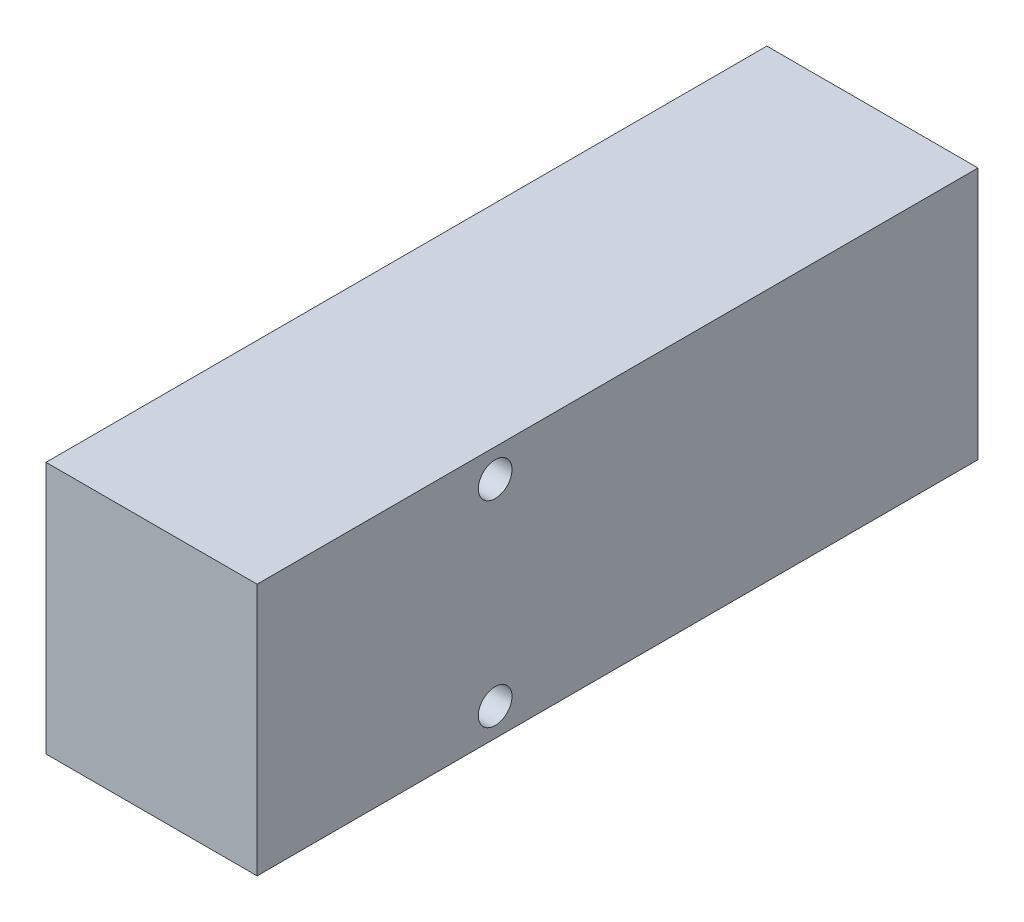
ISO-10303-21;
HEADER;
FILE_DESCRIPTION(('STEP AP214'),'2;1');
FILE_NAME('part.step','',(''),(''),'','','');
FILE_SCHEMA(('AUTOMOTIVE_DESIGN { 1 0 10303 214 1 1 1 1 }'));
ENDSEC;
DATA;
#1=APPLICATION_CONTEXT('core data for automotive mechanical design processes');
#2=APPLICATION_PROTOCOL_DEFINITION('international standard','automotive_design',2000,#1);
#3=PRODUCT_CONTEXT('',#1,'mechanical');
#4=PRODUCT('Part','Part','',(#3));
#5=PRODUCT_RELATED_PRODUCT_CATEGORY('part','',(#4));
#6=PRODUCT_DEFINITION_FORMATION('','',#4);
#7=PRODUCT_DEFINITION_CONTEXT('part definition',#1,'design');
#8=PRODUCT_DEFINITION('design','',#6,#7);
#9=PRODUCT_DEFINITION_SHAPE('','',#8);
#10=(LENGTH_UNIT() NAMED_UNIT(*) SI_UNIT(.MILLI.,.METRE.));
#11=(NAMED_UNIT(*) PLANE_ANGLE_UNIT() SI_UNIT($,.RADIAN.));
#12=(NAMED_UNIT(*) SI_UNIT($,.STERADIAN.) SOLID_ANGLE_UNIT());
#13=UNCERTAINTY_MEASURE_WITH_UNIT(LENGTH_MEASURE(1.E-05),#10,'distance_accuracy_value','');
#14=(GEOMETRIC_REPRESENTATION_CONTEXT(3) GLOBAL_UNCERTAINTY_ASSIGNED_CONTEXT((#13)) GLOBAL_UNIT_ASSIGNED_CONTEXT((#10,
#11,#12)) REPRESENTATION_CONTEXT('',''));
#15=CARTESIAN_POINT('',(0.,0.,0.));
#16=DIRECTION('',(0.,0.,1.));
#17=DIRECTION('',(1.,0.,0.));
#18=AXIS2_PLACEMENT_3D('',#15,#16,#17);
#19=CARTESIAN_POINT('',(40.,-11.25,-11.2));
#20=DIRECTION('',(0.,0.,-1.));
#21=DIRECTION('',(-1.,0.,0.));
#22=AXIS2_PLACEMENT_3D('',#19,#20,#21);
#23=PLANE('',#22);
#24=DIRECTION('',(-1.,0.,0.));
#25=VECTOR('',#24,1.);
#26=CARTESIAN_POINT('',(40.,11.25,-11.2));
#27=LINE('',#26,#25);
#28=CARTESIAN_POINT('',(40.,11.25,-11.2));
#29=VERTEX_POINT('',#28);
#30=CARTESIAN_POINT('',(21.2,11.25,-11.2));
#31=VERTEX_POINT('',#30);
#32=EDGE_CURVE('E98',#29,#31,#27,.T.);
#33=ORIENTED_EDGE('',*,*,#32,.F.);
#34=DIRECTION('',(0.,1.,0.));
#35=VECTOR('',#34,1.);
#36=CARTESIAN_POINT('',(40.,-11.25,-11.2));
#37=LINE('',#36,#35);
#38=CARTESIAN_POINT('',(40.,-11.25,-11.2));
#39=VERTEX_POINT('',#38);
#40=EDGE_CURVE('E11',#39,#29,#37,.T.);
#41=ORIENTED_EDGE('',*,*,#40,.F.);
#42=DIRECTION('',(-1.,0.,0.));
#43=VECTOR('',#42,1.);
#44=CARTESIAN_POINT('',(40.,-11.25,-11.2));
#45=LINE('',#44,#43);
#46=CARTESIAN_POINT('',(21.2,-11.25,-11.2));
#47=VERTEX_POINT('',#46);
#48=EDGE_CURVE('E92',#39,#47,#45,.T.);
#49=ORIENTED_EDGE('',*,*,#48,.T.);
#50=DIRECTION('',(0.,1.,0.));
#51=VECTOR('',#50,1.);
#52=CARTESIAN_POINT('',(21.2,-11.25,-11.2));
#53=LINE('',#52,#51);
#54=EDGE_CURVE('E35',#47,#31,#53,.T.);
#55=ORIENTED_EDGE('',*,*,#54,.T.);
#56=EDGE_LOOP('',(#33,#41,#49,#55));
#57=FACE_BOUND('',#56,.T.);
#58=ADVANCED_FACE('F32',(#57),#23,.T.);
#59=CARTESIAN_POINT('',(40.,-11.25,-11.2));
#60=DIRECTION('',(-1.,0.,0.));
#61=DIRECTION('',(0.,0.,1.));
#62=AXIS2_PLACEMENT_3D('',#59,#60,#61);
#63=PLANE('',#62);
#64=CARTESIAN_POINT('',(40.,-8.75,31.8));
#65=DIRECTION('',(-1.,0.,0.));
#66=DIRECTION('',(0.,0.,1.));
#67=AXIS2_PLACEMENT_3D('',#64,#65,#66);
#68=CIRCLE('',#67,1.5);
#69=CARTESIAN_POINT('',(40.,-8.75,33.3));
#70=VERTEX_POINT('',#69);
#71=EDGE_CURVE('E138',#70,#70,#68,.T.);
#72=ORIENTED_EDGE('',*,*,#71,.T.);
#73=EDGE_LOOP('',(#72));
#74=FACE_BOUND('',#73,.T.);
#75=CARTESIAN_POINT('',(40.,8.75,31.8));
#76=DIRECTION('',(1.,0.,0.));
#77=DIRECTION('',(0.,0.,-1.));
#78=AXIS2_PLACEMENT_3D('',#75,#76,#77);
#79=CIRCLE('',#78,1.5);
#80=CARTESIAN_POINT('',(40.,8.75,30.3));
#81=VERTEX_POINT('',#80);
#82=EDGE_CURVE('E135',#81,#81,#79,.T.);
#83=ORIENTED_EDGE('',*,*,#82,.F.);
#84=EDGE_LOOP('',(#83));
#85=FACE_BOUND('',#84,.T.);
#86=DIRECTION('',(0.,0.,1.));
#87=VECTOR('',#86,1.);
#88=CARTESIAN_POINT('',(40.,11.25,-11.2));
#89=LINE('',#88,#87);
#90=CARTESIAN_POINT('',(40.,11.25,53.));
#91=VERTEX_POINT('',#90);
#92=EDGE_CURVE('E65',#29,#91,#89,.T.);
#93=ORIENTED_EDGE('',*,*,#92,.T.);
#94=DIRECTION('',(0.,1.,0.));
#95=VECTOR('',#94,1.);
#96=CARTESIAN_POINT('',(40.,-11.25,53.));
#97=LINE('',#96,#95);
#98=CARTESIAN_POINT('',(40.,-11.25,53.));
#99=VERTEX_POINT('',#98);
#100=EDGE_CURVE('E41',#99,#91,#97,.T.);
#101=ORIENTED_EDGE('',*,*,#100,.F.);
#102=DIRECTION('',(0.,0.,1.));
#103=VECTOR('',#102,1.);
#104=CARTESIAN_POINT('',(40.,-11.25,-11.2));
#105=LINE('',#104,#103);
#106=EDGE_CURVE('E82',#39,#99,#105,.T.);
#107=ORIENTED_EDGE('',*,*,#106,.F.);
#108=ORIENTED_EDGE('',*,*,#40,.T.);
#109=EDGE_LOOP('',(#93,#101,#107,#108));
#110=FACE_BOUND('',#109,.T.);
#111=ADVANCED_FACE('F109',(#74,#85,#110),#63,.F.);
#112=CARTESIAN_POINT('',(40.,-11.25,53.));
#113=DIRECTION('',(0.,0.,-1.));
#114=DIRECTION('',(-1.,0.,0.));
#115=AXIS2_PLACEMENT_3D('',#112,#113,#114);
#116=PLANE('',#115);
#117=DIRECTION('',(-1.,0.,0.));
#118=VECTOR('',#117,1.);
#119=CARTESIAN_POINT('',(40.,11.25,53.));
#120=LINE('',#119,#118);
#121=CARTESIAN_POINT('',(21.2,11.25,53.));
#122=VERTEX_POINT('',#121);
#123=EDGE_CURVE('E89',#91,#122,#120,.T.);
#124=ORIENTED_EDGE('',*,*,#123,.T.);
#125=DIRECTION('',(0.,1.,0.));
#126=VECTOR('',#125,1.);
#127=CARTESIAN_POINT('',(21.2,-11.25,53.));
#128=LINE('',#127,#126);
#129=CARTESIAN_POINT('',(21.2,-11.25,53.));
#130=VERTEX_POINT('',#129);
#131=EDGE_CURVE('E86',#130,#122,#128,.T.);
#132=ORIENTED_EDGE('',*,*,#131,.F.);
#133=DIRECTION('',(-1.,0.,0.));
#134=VECTOR('',#133,1.);
#135=CARTESIAN_POINT('',(40.,-11.25,53.));
#136=LINE('',#135,#134);
#137=EDGE_CURVE('E77',#99,#130,#136,.T.);
#138=ORIENTED_EDGE('',*,*,#137,.F.);
#139=ORIENTED_EDGE('',*,*,#100,.T.);
#140=EDGE_LOOP('',(#124,#132,#138,#139));
#141=FACE_BOUND('',#140,.T.);
#142=ADVANCED_FACE('F87',(#141),#116,.F.);
#143=CARTESIAN_POINT('',(21.2,-11.25,-11.2));
#144=DIRECTION('',(-1.,0.,0.));
#145=DIRECTION('',(0.,0.,1.));
#146=AXIS2_PLACEMENT_3D('',#143,#144,#145);
#147=PLANE('',#146);
#148=CARTESIAN_POINT('',(21.2,-8.75,31.8));
#149=DIRECTION('',(-1.,0.,0.));
#150=DIRECTION('',(0.,0.,1.));
#151=AXIS2_PLACEMENT_3D('',#148,#149,#150);
#152=CIRCLE('',#151,1.5);
#153=CARTESIAN_POINT('',(21.2,-8.75,33.3));
#154=VERTEX_POINT('',#153);
#155=EDGE_CURVE('E131',#154,#154,#152,.T.);
#156=ORIENTED_EDGE('',*,*,#155,.F.);
#157=EDGE_LOOP('',(#156));
#158=FACE_BOUND('',#157,.T.);
#159=CARTESIAN_POINT('',(21.2,8.75,31.8));
#160=DIRECTION('',(1.,0.,0.));
#161=DIRECTION('',(0.,0.,-1.));
#162=AXIS2_PLACEMENT_3D('',#159,#160,#161);
#163=CIRCLE('',#162,1.5);
#164=CARTESIAN_POINT('',(21.2,8.75,30.3));
#165=VERTEX_POINT('',#164);
#166=EDGE_CURVE('E102',#165,#165,#163,.T.);
#167=ORIENTED_EDGE('',*,*,#166,.T.);
#168=EDGE_LOOP('',(#167));
#169=FACE_BOUND('',#168,.T.);
#170=DIRECTION('',(0.,0.,1.));
#171=VECTOR('',#170,1.);
#172=CARTESIAN_POINT('',(21.2,11.25,-11.2));
#173=LINE('',#172,#171);
#174=EDGE_CURVE('E101',#31,#122,#173,.T.);
#175=ORIENTED_EDGE('',*,*,#174,.F.);
#176=ORIENTED_EDGE('',*,*,#54,.F.);
#177=DIRECTION('',(0.,0.,1.));
#178=VECTOR('',#177,1.);
#179=CARTESIAN_POINT('',(21.2,-11.25,-11.2));
#180=LINE('',#179,#178);
#181=EDGE_CURVE('E81',#47,#130,#180,.T.);
#182=ORIENTED_EDGE('',*,*,#181,.T.);
#183=ORIENTED_EDGE('',*,*,#131,.T.);
#184=EDGE_LOOP('',(#175,#176,#182,#183));
#185=FACE_BOUND('',#184,.T.);
#186=ADVANCED_FACE('F91',(#158,#169,#185),#147,.T.);
#187=CARTESIAN_POINT('',(0.,-11.25,0.));
#188=DIRECTION('',(0.,1.,0.));
#189=DIRECTION('',(0.,0.,1.));
#190=AXIS2_PLACEMENT_3D('',#187,#188,#189);
#191=PLANE('',#190);
#192=ORIENTED_EDGE('',*,*,#48,.F.);
#193=ORIENTED_EDGE('',*,*,#106,.T.);
#194=ORIENTED_EDGE('',*,*,#137,.T.);
#195=ORIENTED_EDGE('',*,*,#181,.F.);
#196=EDGE_LOOP('',(#192,#193,#194,#195));
#197=FACE_BOUND('',#196,.T.);
#198=ADVANCED_FACE('F80',(#197),#191,.F.);
#199=CARTESIAN_POINT('',(0.,11.25,0.));
#200=DIRECTION('',(0.,1.,0.));
#201=DIRECTION('',(0.,0.,1.));
#202=AXIS2_PLACEMENT_3D('',#199,#200,#201);
#203=PLANE('',#202);
#204=ORIENTED_EDGE('',*,*,#32,.T.);
#205=ORIENTED_EDGE('',*,*,#174,.T.);
#206=ORIENTED_EDGE('',*,*,#123,.F.);
#207=ORIENTED_EDGE('',*,*,#92,.F.);
#208=EDGE_LOOP('',(#204,#205,#206,#207));
#209=FACE_BOUND('',#208,.T.);
#210=ADVANCED_FACE('F107',(#209),#203,.T.);
#211=CARTESIAN_POINT('',(21.2,8.75,31.8));
#212=DIRECTION('',(1.,0.,0.));
#213=DIRECTION('',(0.,0.,-1.));
#214=AXIS2_PLACEMENT_3D('',#211,#212,#213);
#215=CYLINDRICAL_SURFACE('',#214,1.5);
#216=ORIENTED_EDGE('',*,*,#166,.F.);
#217=EDGE_LOOP('',(#216));
#218=FACE_BOUND('',#217,.T.);
#219=ORIENTED_EDGE('',*,*,#82,.T.);
#220=EDGE_LOOP('',(#219));
#221=FACE_BOUND('',#220,.T.);
#222=ADVANCED_FACE('F145',(#218,#221),#215,.F.);
#223=CARTESIAN_POINT('',(21.2,-8.75,31.8));
#224=DIRECTION('',(1.,0.,0.));
#225=DIRECTION('',(0.,0.,-1.));
#226=AXIS2_PLACEMENT_3D('',#223,#224,#225);
#227=CYLINDRICAL_SURFACE('',#226,1.5);
#228=ORIENTED_EDGE('',*,*,#155,.T.);
#229=EDGE_LOOP('',(#228));
#230=FACE_BOUND('',#229,.T.);
#231=ORIENTED_EDGE('',*,*,#71,.F.);
#232=EDGE_LOOP('',(#231));
#233=FACE_BOUND('',#232,.T.);
#234=ADVANCED_FACE('F143',(#230,#233),#227,.F.);
#235=CLOSED_SHELL('',(#58,#111,#142,#186,#198,#210,#222,#234));
#236=MANIFOLD_SOLID_BREP('B2',#235);
#237=ADVANCED_BREP_SHAPE_REPRESENTATION('',(#18,#236),#14);
#238=SHAPE_DEFINITION_REPRESENTATION(#9,#237);
ENDSEC;
END-ISO-10303-21;
